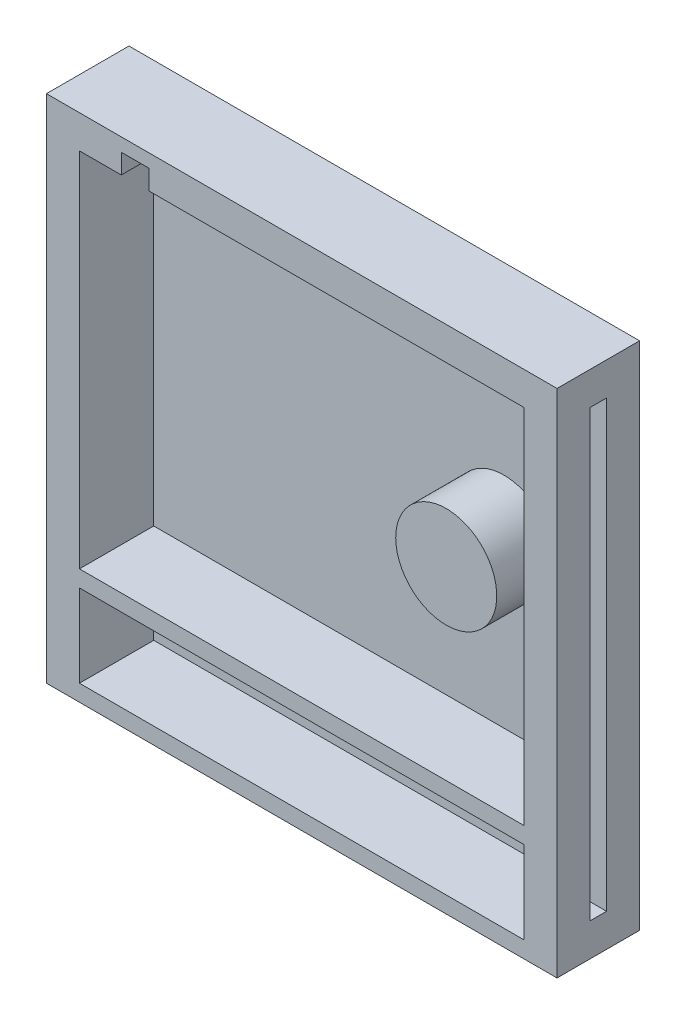
ISO-10303-21;
HEADER;
FILE_DESCRIPTION(('STEP AP214'),'2;1');
FILE_NAME('part.step','',(''),(''),'','','');
FILE_SCHEMA(('AUTOMOTIVE_DESIGN { 1 0 10303 214 1 1 1 1 }'));
ENDSEC;
DATA;
#1=APPLICATION_CONTEXT('core data for automotive mechanical design processes');
#2=APPLICATION_PROTOCOL_DEFINITION('international standard','automotive_design',2000,#1);
#3=PRODUCT_CONTEXT('',#1,'mechanical');
#4=PRODUCT('Part','Part','',(#3));
#5=PRODUCT_RELATED_PRODUCT_CATEGORY('part','',(#4));
#6=PRODUCT_DEFINITION_FORMATION('','',#4);
#7=PRODUCT_DEFINITION_CONTEXT('part definition',#1,'design');
#8=PRODUCT_DEFINITION('design','',#6,#7);
#9=PRODUCT_DEFINITION_SHAPE('','',#8);
#10=(LENGTH_UNIT() NAMED_UNIT(*) SI_UNIT(.MILLI.,.METRE.));
#11=(NAMED_UNIT(*) PLANE_ANGLE_UNIT() SI_UNIT($,.RADIAN.));
#12=(NAMED_UNIT(*) SI_UNIT($,.STERADIAN.) SOLID_ANGLE_UNIT());
#13=UNCERTAINTY_MEASURE_WITH_UNIT(LENGTH_MEASURE(1.E-05),#10,'distance_accuracy_value','');
#14=(GEOMETRIC_REPRESENTATION_CONTEXT(3) GLOBAL_UNCERTAINTY_ASSIGNED_CONTEXT((#13)) GLOBAL_UNIT_ASSIGNED_CONTEXT((#10,
#11,#12)) REPRESENTATION_CONTEXT('',''));
#15=CARTESIAN_POINT('',(0.,0.,0.));
#16=DIRECTION('',(0.,0.,1.));
#17=DIRECTION('',(1.,0.,0.));
#18=AXIS2_PLACEMENT_3D('',#15,#16,#17);
#19=CARTESIAN_POINT('',(78.5678966446695,78.5678966446696,25.4));
#20=DIRECTION('',(-1.,0.,0.));
#21=DIRECTION('',(0.,-1.,0.));
#22=AXIS2_PLACEMENT_3D('',#19,#20,#21);
#23=PLANE('',#22);
#24=DIRECTION('',(0.,1.,0.));
#25=VECTOR('',#24,1.);
#26=CARTESIAN_POINT('',(78.5678966446695,78.5678966446696,0.));
#27=LINE('',#26,#25);
#28=CARTESIAN_POINT('',(78.5678966446696,-78.5678966446696,0.));
#29=VERTEX_POINT('',#28);
#30=CARTESIAN_POINT('',(78.5678966446695,78.5678966446696,0.));
#31=VERTEX_POINT('',#30);
#32=EDGE_CURVE('E365',#29,#31,#27,.T.);
#33=ORIENTED_EDGE('',*,*,#32,.T.);
#34=DIRECTION('',(0.,0.,-1.));
#35=VECTOR('',#34,1.);
#36=CARTESIAN_POINT('',(78.5678966446695,78.5678966446696,25.4));
#37=LINE('',#36,#35);
#38=CARTESIAN_POINT('',(78.5678966446695,78.5678966446696,25.4));
#39=VERTEX_POINT('',#38);
#40=EDGE_CURVE('E370',#39,#31,#37,.T.);
#41=ORIENTED_EDGE('',*,*,#40,.F.);
#42=DIRECTION('',(0.,1.,0.));
#43=VECTOR('',#42,1.);
#44=CARTESIAN_POINT('',(78.5678966446695,78.5678966446696,25.4));
#45=LINE('',#44,#43);
#46=CARTESIAN_POINT('',(78.5678966446696,-78.5678966446696,25.4));
#47=VERTEX_POINT('',#46);
#48=EDGE_CURVE('E356',#47,#39,#45,.T.);
#49=ORIENTED_EDGE('',*,*,#48,.F.);
#50=DIRECTION('',(0.,0.,-1.));
#51=VECTOR('',#50,1.);
#52=CARTESIAN_POINT('',(78.5678966446696,-78.5678966446696,25.4));
#53=LINE('',#52,#51);
#54=EDGE_CURVE('E373',#47,#29,#53,.T.);
#55=ORIENTED_EDGE('',*,*,#54,.T.);
#56=EDGE_LOOP('',(#33,#41,#49,#55));
#57=FACE_BOUND('',#56,.T.);
#58=DIRECTION('',(0.,1.,0.));
#59=VECTOR('',#58,1.);
#60=CARTESIAN_POINT('',(78.5678966446695,-68.4078966446696,15.24));
#61=LINE('',#60,#59);
#62=CARTESIAN_POINT('',(78.5678966446696,-68.4078966446696,15.24));
#63=VERTEX_POINT('',#62);
#64=CARTESIAN_POINT('',(78.5678966446696,68.4078966446695,15.24));
#65=VERTEX_POINT('',#64);
#66=EDGE_CURVE('E59',#63,#65,#61,.T.);
#67=ORIENTED_EDGE('',*,*,#66,.T.);
#68=DIRECTION('',(0.,0.,-1.));
#69=VECTOR('',#68,1.);
#70=CARTESIAN_POINT('',(78.5678966446696,68.4078966446695,15.24));
#71=LINE('',#70,#69);
#72=CARTESIAN_POINT('',(78.5678966446696,68.4078966446695,10.16));
#73=VERTEX_POINT('',#72);
#74=EDGE_CURVE('E231',#65,#73,#71,.T.);
#75=ORIENTED_EDGE('',*,*,#74,.T.);
#76=DIRECTION('',(0.,-1.,0.));
#77=VECTOR('',#76,1.);
#78=CARTESIAN_POINT('',(78.5678966446695,-68.4078966446696,10.16));
#79=LINE('',#78,#77);
#80=CARTESIAN_POINT('',(78.5678966446695,-68.4078966446696,10.16));
#81=VERTEX_POINT('',#80);
#82=EDGE_CURVE('E242',#73,#81,#79,.T.);
#83=ORIENTED_EDGE('',*,*,#82,.T.);
#84=DIRECTION('',(0.,0.,1.));
#85=VECTOR('',#84,1.);
#86=CARTESIAN_POINT('',(78.5678966446695,-68.4078966446696,15.24));
#87=LINE('',#86,#85);
#88=EDGE_CURVE('E239',#81,#63,#87,.T.);
#89=ORIENTED_EDGE('',*,*,#88,.T.);
#90=EDGE_LOOP('',(#67,#75,#83,#89));
#91=FACE_BOUND('',#90,.T.);
#92=ADVANCED_FACE('F36',(#57,#91),#23,.F.);
#93=CARTESIAN_POINT('',(-78.5678966446696,78.5678966446695,25.4));
#94=DIRECTION('',(1.,0.,0.));
#95=DIRECTION('',(0.,1.,0.));
#96=AXIS2_PLACEMENT_3D('',#93,#94,#95);
#97=PLANE('',#96);
#98=DIRECTION('',(0.,0.,-1.));
#99=VECTOR('',#98,1.);
#100=CARTESIAN_POINT('',(-78.5678966446696,68.4078966446695,15.24));
#101=LINE('',#100,#99);
#102=CARTESIAN_POINT('',(-78.5678966446696,68.4078966446695,15.24));
#103=VERTEX_POINT('',#102);
#104=CARTESIAN_POINT('',(-78.5678966446696,68.4078966446695,10.16));
#105=VERTEX_POINT('',#104);
#106=EDGE_CURVE('E270',#103,#105,#101,.T.);
#107=ORIENTED_EDGE('',*,*,#106,.F.);
#108=DIRECTION('',(0.,1.,0.));
#109=VECTOR('',#108,1.);
#110=CARTESIAN_POINT('',(-78.5678966446695,-68.4078966446696,15.24));
#111=LINE('',#110,#109);
#112=CARTESIAN_POINT('',(-78.5678966446695,-68.4078966446696,15.24));
#113=VERTEX_POINT('',#112);
#114=EDGE_CURVE('E249',#113,#103,#111,.T.);
#115=ORIENTED_EDGE('',*,*,#114,.F.);
#116=DIRECTION('',(0.,0.,1.));
#117=VECTOR('',#116,1.);
#118=CARTESIAN_POINT('',(-78.5678966446695,-68.4078966446696,15.24));
#119=LINE('',#118,#117);
#120=CARTESIAN_POINT('',(-78.5678966446695,-68.4078966446696,10.16));
#121=VERTEX_POINT('',#120);
#122=EDGE_CURVE('E259',#121,#113,#119,.T.);
#123=ORIENTED_EDGE('',*,*,#122,.F.);
#124=DIRECTION('',(0.,-1.,0.));
#125=VECTOR('',#124,1.);
#126=CARTESIAN_POINT('',(-78.5678966446695,-68.4078966446696,10.16));
#127=LINE('',#126,#125);
#128=EDGE_CURVE('E273',#105,#121,#127,.T.);
#129=ORIENTED_EDGE('',*,*,#128,.F.);
#130=EDGE_LOOP('',(#107,#115,#123,#129));
#131=FACE_BOUND('',#130,.T.);
#132=DIRECTION('',(0.,-1.,0.));
#133=VECTOR('',#132,1.);
#134=CARTESIAN_POINT('',(-78.5678966446696,78.5678966446695,0.));
#135=LINE('',#134,#133);
#136=CARTESIAN_POINT('',(-78.5678966446696,78.5678966446695,0.));
#137=VERTEX_POINT('',#136);
#138=CARTESIAN_POINT('',(-78.5678966446695,-78.5678966446696,0.));
#139=VERTEX_POINT('',#138);
#140=EDGE_CURVE('E349',#137,#139,#135,.T.);
#141=ORIENTED_EDGE('',*,*,#140,.T.);
#142=DIRECTION('',(0.,0.,-1.));
#143=VECTOR('',#142,1.);
#144=CARTESIAN_POINT('',(-78.5678966446695,-78.5678966446696,25.4));
#145=LINE('',#144,#143);
#146=CARTESIAN_POINT('',(-78.5678966446695,-78.5678966446696,25.4));
#147=VERTEX_POINT('',#146);
#148=EDGE_CURVE('E44',#147,#139,#145,.T.);
#149=ORIENTED_EDGE('',*,*,#148,.F.);
#150=DIRECTION('',(0.,-1.,0.));
#151=VECTOR('',#150,1.);
#152=CARTESIAN_POINT('',(-78.5678966446696,78.5678966446695,25.4));
#153=LINE('',#152,#151);
#154=CARTESIAN_POINT('',(-78.5678966446696,78.5678966446695,25.4));
#155=VERTEX_POINT('',#154);
#156=EDGE_CURVE('E350',#155,#147,#153,.T.);
#157=ORIENTED_EDGE('',*,*,#156,.F.);
#158=DIRECTION('',(0.,0.,-1.));
#159=VECTOR('',#158,1.);
#160=CARTESIAN_POINT('',(-78.5678966446696,78.5678966446695,25.4));
#161=LINE('',#160,#159);
#162=EDGE_CURVE('E360',#155,#137,#161,.T.);
#163=ORIENTED_EDGE('',*,*,#162,.T.);
#164=EDGE_LOOP('',(#141,#149,#157,#163));
#165=FACE_BOUND('',#164,.T.);
#166=ADVANCED_FACE('F38',(#131,#165),#97,.F.);
#167=CARTESIAN_POINT('',(78.5678966446696,-78.5678966446696,25.4));
#168=DIRECTION('',(0.,1.,0.));
#169=DIRECTION('',(-1.,0.,0.));
#170=AXIS2_PLACEMENT_3D('',#167,#168,#169);
#171=PLANE('',#170);
#172=DIRECTION('',(1.,0.,0.));
#173=VECTOR('',#172,1.);
#174=CARTESIAN_POINT('',(78.5678966446696,-78.5678966446696,0.));
#175=LINE('',#174,#173);
#176=EDGE_CURVE('E363',#139,#29,#175,.T.);
#177=ORIENTED_EDGE('',*,*,#176,.T.);
#178=ORIENTED_EDGE('',*,*,#54,.F.);
#179=DIRECTION('',(1.,0.,0.));
#180=VECTOR('',#179,1.);
#181=CARTESIAN_POINT('',(78.5678966446696,-78.5678966446696,25.4));
#182=LINE('',#181,#180);
#183=EDGE_CURVE('E353',#147,#47,#182,.T.);
#184=ORIENTED_EDGE('',*,*,#183,.F.);
#185=ORIENTED_EDGE('',*,*,#148,.T.);
#186=EDGE_LOOP('',(#177,#178,#184,#185));
#187=FACE_BOUND('',#186,.T.);
#188=ADVANCED_FACE('F378',(#187),#171,.F.);
#189=CARTESIAN_POINT('',(78.5678966446695,78.5678966446696,25.4));
#190=DIRECTION('',(0.,-1.,0.));
#191=DIRECTION('',(1.,0.,0.));
#192=AXIS2_PLACEMENT_3D('',#189,#190,#191);
#193=PLANE('',#192);
#194=DIRECTION('',(-1.,0.,0.));
#195=VECTOR('',#194,1.);
#196=CARTESIAN_POINT('',(78.5678966446695,78.5678966446696,0.));
#197=LINE('',#196,#195);
#198=EDGE_CURVE('E354',#31,#137,#197,.T.);
#199=ORIENTED_EDGE('',*,*,#198,.T.);
#200=ORIENTED_EDGE('',*,*,#162,.F.);
#201=DIRECTION('',(-1.,0.,0.));
#202=VECTOR('',#201,1.);
#203=CARTESIAN_POINT('',(78.5678966446695,78.5678966446696,25.4));
#204=LINE('',#203,#202);
#205=EDGE_CURVE('E358',#39,#155,#204,.T.);
#206=ORIENTED_EDGE('',*,*,#205,.F.);
#207=ORIENTED_EDGE('',*,*,#40,.T.);
#208=EDGE_LOOP('',(#199,#200,#206,#207));
#209=FACE_BOUND('',#208,.T.);
#210=ADVANCED_FACE('F394',(#209),#193,.F.);
#211=CARTESIAN_POINT('',(0.,0.,25.4));
#212=DIRECTION('',(0.,0.,-1.));
#213=DIRECTION('',(-1.,0.,0.));
#214=AXIS2_PLACEMENT_3D('',#211,#212,#213);
#215=PLANE('',#214);
#216=DIRECTION('',(0.,-1.,0.));
#217=VECTOR('',#216,1.);
#218=CARTESIAN_POINT('',(-68.4078966446696,-48.0878966446696,25.4));
#219=LINE('',#218,#217);
#220=CARTESIAN_POINT('',(-68.4078966446696,-48.0878966446696,25.4));
#221=VERTEX_POINT('',#220);
#222=CARTESIAN_POINT('',(-68.4078966446696,-73.4878966446696,25.4));
#223=VERTEX_POINT('',#222);
#224=EDGE_CURVE('E290',#221,#223,#219,.T.);
#225=ORIENTED_EDGE('',*,*,#224,.F.);
#226=DIRECTION('',(-1.,0.,0.));
#227=VECTOR('',#226,1.);
#228=CARTESIAN_POINT('',(68.4078966446696,-48.0878966446696,25.4));
#229=LINE('',#228,#227);
#230=CARTESIAN_POINT('',(68.4078966446696,-48.0878966446696,25.4));
#231=VERTEX_POINT('',#230);
#232=EDGE_CURVE('E293',#231,#221,#229,.T.);
#233=ORIENTED_EDGE('',*,*,#232,.F.);
#234=DIRECTION('',(0.,1.,0.));
#235=VECTOR('',#234,1.);
#236=CARTESIAN_POINT('',(68.4078966446696,-48.0878966446696,25.4));
#237=LINE('',#236,#235);
#238=CARTESIAN_POINT('',(68.4078966446696,-73.4878966446696,25.4));
#239=VERTEX_POINT('',#238);
#240=EDGE_CURVE('E280',#239,#231,#237,.T.);
#241=ORIENTED_EDGE('',*,*,#240,.F.);
#242=DIRECTION('',(1.,0.,0.));
#243=VECTOR('',#242,1.);
#244=CARTESIAN_POINT('',(68.4078966446696,-73.4878966446696,25.4));
#245=LINE('',#244,#243);
#246=EDGE_CURVE('E287',#223,#239,#245,.T.);
#247=ORIENTED_EDGE('',*,*,#246,.F.);
#248=EDGE_LOOP('',(#225,#233,#241,#247));
#249=FACE_BOUND('',#248,.T.);
#250=DIRECTION('',(-1.,0.,0.));
#251=VECTOR('',#250,1.);
#252=CARTESIAN_POINT('',(0.,68.4078966446696,25.4));
#253=LINE('',#252,#251);
#254=CARTESIAN_POINT('',(-55.5371323051972,68.4078966446696,25.4));
#255=VERTEX_POINT('',#254);
#256=CARTESIAN_POINT('',(-68.4078966446696,68.4078966446696,25.4));
#257=VERTEX_POINT('',#256);
#258=EDGE_CURVE('E321',#255,#257,#253,.T.);
#259=ORIENTED_EDGE('',*,*,#258,.F.);
#260=DIRECTION('',(0.,-1.,0.));
#261=VECTOR('',#260,1.);
#262=CARTESIAN_POINT('',(-55.5371323051972,74.4707776309536,25.4));
#263=LINE('',#262,#261);
#264=CARTESIAN_POINT('',(-55.5371323051972,74.4707776309536,25.4));
#265=VERTEX_POINT('',#264);
#266=EDGE_CURVE('E701',#265,#255,#263,.T.);
#267=ORIENTED_EDGE('',*,*,#266,.F.);
#268=DIRECTION('',(-1.,0.,0.));
#269=VECTOR('',#268,1.);
#270=CARTESIAN_POINT('',(-55.5371323051972,74.4707776309536,25.4));
#271=LINE('',#270,#269);
#272=CARTESIAN_POINT('',(-47.0507568190186,74.4707776309536,25.4));
#273=VERTEX_POINT('',#272);
#274=EDGE_CURVE('E706',#273,#265,#271,.T.);
#275=ORIENTED_EDGE('',*,*,#274,.F.);
#276=DIRECTION('',(0.,1.,0.));
#277=VECTOR('',#276,1.);
#278=CARTESIAN_POINT('',(-47.0507568190186,74.4707776309536,25.4));
#279=LINE('',#278,#277);
#280=CARTESIAN_POINT('',(-47.0507568190186,68.4078966446696,25.4));
#281=VERTEX_POINT('',#280);
#282=EDGE_CURVE('E703',#281,#273,#279,.T.);
#283=ORIENTED_EDGE('',*,*,#282,.F.);
#284=CARTESIAN_POINT('',(68.4078966446696,68.4078966446696,25.4));
#285=VERTEX_POINT('',#284);
#286=EDGE_CURVE('E219',#285,#281,#253,.T.);
#287=ORIENTED_EDGE('',*,*,#286,.F.);
#288=DIRECTION('',(0.,-1.,0.));
#289=VECTOR('',#288,1.);
#290=CARTESIAN_POINT('',(68.4078966446696,0.,25.4));
#291=LINE('',#290,#289);
#292=CARTESIAN_POINT('',(68.4078966446696,-43.0078966446696,25.4));
#293=VERTEX_POINT('',#292);
#294=EDGE_CURVE('E322',#285,#293,#291,.T.);
#295=ORIENTED_EDGE('',*,*,#294,.T.);
#296=DIRECTION('',(1.,0.,0.));
#297=VECTOR('',#296,1.);
#298=CARTESIAN_POINT('',(0.,-43.0078966446696,25.4));
#299=LINE('',#298,#297);
#300=CARTESIAN_POINT('',(-68.4078966446696,-43.0078966446696,25.4));
#301=VERTEX_POINT('',#300);
#302=EDGE_CURVE('E327',#301,#293,#299,.T.);
#303=ORIENTED_EDGE('',*,*,#302,.F.);
#304=DIRECTION('',(0.,-1.,0.));
#305=VECTOR('',#304,1.);
#306=CARTESIAN_POINT('',(-68.4078966446696,0.,25.4));
#307=LINE('',#306,#305);
#308=EDGE_CURVE('E330',#257,#301,#307,.T.);
#309=ORIENTED_EDGE('',*,*,#308,.F.);
#310=EDGE_LOOP('',(#259,#267,#275,#283,#287,#295,#303,#309));
#311=FACE_BOUND('',#310,.T.);
#312=ORIENTED_EDGE('',*,*,#156,.T.);
#313=ORIENTED_EDGE('',*,*,#183,.T.);
#314=ORIENTED_EDGE('',*,*,#48,.T.);
#315=ORIENTED_EDGE('',*,*,#205,.T.);
#316=EDGE_LOOP('',(#312,#313,#314,#315));
#317=FACE_BOUND('',#316,.T.);
#318=ADVANCED_FACE('F396',(#249,#311,#317),#215,.F.);
#319=CARTESIAN_POINT('',(0.,0.,0.));
#320=DIRECTION('',(0.,0.,-1.));
#321=DIRECTION('',(-1.,0.,0.));
#322=AXIS2_PLACEMENT_3D('',#319,#320,#321);
#323=PLANE('',#322);
#324=ORIENTED_EDGE('',*,*,#140,.F.);
#325=ORIENTED_EDGE('',*,*,#198,.F.);
#326=ORIENTED_EDGE('',*,*,#32,.F.);
#327=ORIENTED_EDGE('',*,*,#176,.F.);
#328=EDGE_LOOP('',(#324,#325,#326,#327));
#329=FACE_BOUND('',#328,.T.);
#330=ADVANCED_FACE('F386',(#329),#323,.T.);
#331=CARTESIAN_POINT('',(0.,0.,2.54));
#332=DIRECTION('',(0.,0.,-1.));
#333=DIRECTION('',(-1.,0.,0.));
#334=AXIS2_PLACEMENT_3D('',#331,#332,#333);
#335=PLANE('',#334);
#336=CARTESIAN_POINT('',(39.3912837456988,8.89894553217759,2.54));
#337=DIRECTION('',(0.,0.,-1.));
#338=DIRECTION('',(-1.,0.,0.));
#339=AXIS2_PLACEMENT_3D('',#336,#337,#338);
#340=CIRCLE('',#339,15.5472067606427);
#341=CARTESIAN_POINT('',(23.8440769850561,8.89894553217759,2.54));
#342=VERTEX_POINT('',#341);
#343=EDGE_CURVE('E12',#342,#342,#340,.F.);
#344=ORIENTED_EDGE('',*,*,#343,.F.);
#345=EDGE_LOOP('',(#344));
#346=FACE_BOUND('',#345,.T.);
#347=DIRECTION('',(0.,-1.,0.));
#348=VECTOR('',#347,1.);
#349=CARTESIAN_POINT('',(-68.4078966446696,0.,2.53999999999999));
#350=LINE('',#349,#348);
#351=CARTESIAN_POINT('',(-68.4078966446696,68.4078966446696,2.53999999999999));
#352=VERTEX_POINT('',#351);
#353=CARTESIAN_POINT('',(-68.4078966446696,-43.0078966446696,2.53999999999999));
#354=VERTEX_POINT('',#353);
#355=EDGE_CURVE('E336',#352,#354,#350,.T.);
#356=ORIENTED_EDGE('',*,*,#355,.T.);
#357=DIRECTION('',(1.,0.,0.));
#358=VECTOR('',#357,1.);
#359=CARTESIAN_POINT('',(0.,-43.0078966446696,2.53999999999999));
#360=LINE('',#359,#358);
#361=CARTESIAN_POINT('',(68.4078966446696,-43.0078966446696,2.53999999999999));
#362=VERTEX_POINT('',#361);
#363=EDGE_CURVE('E320',#354,#362,#360,.T.);
#364=ORIENTED_EDGE('',*,*,#363,.T.);
#365=DIRECTION('',(0.,-1.,0.));
#366=VECTOR('',#365,1.);
#367=CARTESIAN_POINT('',(68.4078966446696,0.,2.53999999999999));
#368=LINE('',#367,#366);
#369=CARTESIAN_POINT('',(68.4078966446696,68.4078966446696,2.53999999999999));
#370=VERTEX_POINT('',#369);
#371=EDGE_CURVE('E318',#370,#362,#368,.T.);
#372=ORIENTED_EDGE('',*,*,#371,.F.);
#373=DIRECTION('',(-1.,0.,0.));
#374=VECTOR('',#373,1.);
#375=CARTESIAN_POINT('',(0.,68.4078966446696,2.53999999999999));
#376=LINE('',#375,#374);
#377=EDGE_CURVE('E325',#370,#352,#376,.T.);
#378=ORIENTED_EDGE('',*,*,#377,.T.);
#379=EDGE_LOOP('',(#356,#364,#372,#378));
#380=FACE_BOUND('',#379,.T.);
#381=ADVANCED_FACE('F404',(#346,#380),#335,.F.);
#382=CARTESIAN_POINT('',(0.,-43.0078966446696,-176.442739402005));
#383=DIRECTION('',(0.,-1.,0.));
#384=DIRECTION('',(0.,0.,-1.));
#385=AXIS2_PLACEMENT_3D('',#382,#383,#384);
#386=PLANE('',#385);
#387=DIRECTION('',(0.,0.,1.));
#388=VECTOR('',#387,1.);
#389=CARTESIAN_POINT('',(-68.4078966446696,-43.0078966446696,-176.442739402005));
#390=LINE('',#389,#388);
#391=EDGE_CURVE('E339',#354,#301,#390,.T.);
#392=ORIENTED_EDGE('',*,*,#391,.T.);
#393=ORIENTED_EDGE('',*,*,#302,.T.);
#394=DIRECTION('',(0.,0.,1.));
#395=VECTOR('',#394,1.);
#396=CARTESIAN_POINT('',(68.4078966446696,-43.0078966446696,-176.442739402005));
#397=LINE('',#396,#395);
#398=EDGE_CURVE('E335',#362,#293,#397,.T.);
#399=ORIENTED_EDGE('',*,*,#398,.F.);
#400=ORIENTED_EDGE('',*,*,#363,.F.);
#401=EDGE_LOOP('',(#392,#393,#399,#400));
#402=FACE_BOUND('',#401,.T.);
#403=ADVANCED_FACE('F439',(#402),#386,.F.);
#404=CARTESIAN_POINT('',(68.4078966446696,0.,-176.442739402005));
#405=DIRECTION('',(-1.,0.,0.));
#406=DIRECTION('',(0.,0.,1.));
#407=AXIS2_PLACEMENT_3D('',#404,#405,#406);
#408=PLANE('',#407);
#409=ORIENTED_EDGE('',*,*,#371,.T.);
#410=ORIENTED_EDGE('',*,*,#398,.T.);
#411=ORIENTED_EDGE('',*,*,#294,.F.);
#412=DIRECTION('',(0.,0.,1.));
#413=VECTOR('',#412,1.);
#414=CARTESIAN_POINT('',(68.4078966446696,68.4078966446696,-176.442739402005));
#415=LINE('',#414,#413);
#416=EDGE_CURVE('E326',#370,#285,#415,.T.);
#417=ORIENTED_EDGE('',*,*,#416,.F.);
#418=EDGE_LOOP('',(#409,#410,#411,#417));
#419=FACE_BOUND('',#418,.T.);
#420=ADVANCED_FACE('F444',(#419),#408,.T.);
#421=CARTESIAN_POINT('',(0.,68.4078966446696,-176.442739402005));
#422=DIRECTION('',(0.,1.,0.));
#423=DIRECTION('',(0.,0.,1.));
#424=AXIS2_PLACEMENT_3D('',#421,#422,#423);
#425=PLANE('',#424);
#426=DIRECTION('',(1.,0.,0.));
#427=VECTOR('',#426,1.);
#428=CARTESIAN_POINT('',(-55.5371323051972,68.4078966446696,10.16));
#429=LINE('',#428,#427);
#430=CARTESIAN_POINT('',(-55.5371323051972,68.4078966446696,10.16));
#431=VERTEX_POINT('',#430);
#432=CARTESIAN_POINT('',(-47.0507568190186,68.4078966446696,10.16));
#433=VERTEX_POINT('',#432);
#434=EDGE_CURVE('E209',#431,#433,#429,.T.);
#435=ORIENTED_EDGE('',*,*,#434,.F.);
#436=DIRECTION('',(0.,0.,1.));
#437=VECTOR('',#436,1.);
#438=CARTESIAN_POINT('',(-55.5371323051972,68.4078966446696,10.16));
#439=LINE('',#438,#437);
#440=EDGE_CURVE('E220',#431,#255,#439,.T.);
#441=ORIENTED_EDGE('',*,*,#440,.T.);
#442=ORIENTED_EDGE('',*,*,#258,.T.);
#443=DIRECTION('',(0.,0.,1.));
#444=VECTOR('',#443,1.);
#445=CARTESIAN_POINT('',(-68.4078966446696,68.4078966446696,-176.442739402005));
#446=LINE('',#445,#444);
#447=EDGE_CURVE('E340',#352,#257,#446,.T.);
#448=ORIENTED_EDGE('',*,*,#447,.F.);
#449=ORIENTED_EDGE('',*,*,#377,.F.);
#450=ORIENTED_EDGE('',*,*,#416,.T.);
#451=ORIENTED_EDGE('',*,*,#286,.T.);
#452=DIRECTION('',(0.,0.,1.));
#453=VECTOR('',#452,1.);
#454=CARTESIAN_POINT('',(-47.0507568190186,68.4078966446696,10.16));
#455=LINE('',#454,#453);
#456=EDGE_CURVE('E204',#433,#281,#455,.T.);
#457=ORIENTED_EDGE('',*,*,#456,.F.);
#458=EDGE_LOOP('',(#435,#441,#442,#448,#449,#450,#451,#457));
#459=FACE_BOUND('',#458,.T.);
#460=ADVANCED_FACE('F217',(#459),#425,.F.);
#461=CARTESIAN_POINT('',(-68.4078966446696,0.,-176.442739402005));
#462=DIRECTION('',(-1.,0.,0.));
#463=DIRECTION('',(0.,0.,1.));
#464=AXIS2_PLACEMENT_3D('',#461,#462,#463);
#465=PLANE('',#464);
#466=ORIENTED_EDGE('',*,*,#447,.T.);
#467=ORIENTED_EDGE('',*,*,#308,.T.);
#468=ORIENTED_EDGE('',*,*,#391,.F.);
#469=ORIENTED_EDGE('',*,*,#355,.F.);
#470=EDGE_LOOP('',(#466,#467,#468,#469));
#471=FACE_BOUND('',#470,.T.);
#472=ADVANCED_FACE('F461',(#471),#465,.F.);
#473=CARTESIAN_POINT('',(0.,0.,2.54));
#474=DIRECTION('',(0.,0.,-1.));
#475=DIRECTION('',(-1.,0.,0.));
#476=AXIS2_PLACEMENT_3D('',#473,#474,#475);
#477=PLANE('',#476);
#478=DIRECTION('',(0.,1.,0.));
#479=VECTOR('',#478,1.);
#480=CARTESIAN_POINT('',(68.4078966446696,-48.0878966446696,2.53999999999999));
#481=LINE('',#480,#479);
#482=CARTESIAN_POINT('',(68.4078966446696,-73.4878966446696,2.53999999999999));
#483=VERTEX_POINT('',#482);
#484=CARTESIAN_POINT('',(68.4078966446696,-48.0878966446696,2.53999999999999));
#485=VERTEX_POINT('',#484);
#486=EDGE_CURVE('E301',#483,#485,#481,.T.);
#487=ORIENTED_EDGE('',*,*,#486,.T.);
#488=DIRECTION('',(-1.,0.,0.));
#489=VECTOR('',#488,1.);
#490=CARTESIAN_POINT('',(68.4078966446696,-48.0878966446696,2.53999999999999));
#491=LINE('',#490,#489);
#492=CARTESIAN_POINT('',(-68.4078966446696,-48.0878966446696,2.53999999999999));
#493=VERTEX_POINT('',#492);
#494=EDGE_CURVE('E289',#485,#493,#491,.T.);
#495=ORIENTED_EDGE('',*,*,#494,.T.);
#496=DIRECTION('',(0.,-1.,0.));
#497=VECTOR('',#496,1.);
#498=CARTESIAN_POINT('',(-68.4078966446696,-48.0878966446696,2.53999999999999));
#499=LINE('',#498,#497);
#500=CARTESIAN_POINT('',(-68.4078966446696,-73.4878966446696,2.53999999999999));
#501=VERTEX_POINT('',#500);
#502=EDGE_CURVE('E310',#493,#501,#499,.T.);
#503=ORIENTED_EDGE('',*,*,#502,.T.);
#504=DIRECTION('',(1.,0.,0.));
#505=VECTOR('',#504,1.);
#506=CARTESIAN_POINT('',(68.4078966446696,-73.4878966446696,2.53999999999999));
#507=LINE('',#506,#505);
#508=EDGE_CURVE('E306',#501,#483,#507,.T.);
#509=ORIENTED_EDGE('',*,*,#508,.T.);
#510=EDGE_LOOP('',(#487,#495,#503,#509));
#511=FACE_BOUND('',#510,.T.);
#512=ADVANCED_FACE('F466',(#511),#477,.F.);
#513=CARTESIAN_POINT('',(68.4078966446696,-48.0878966446696,-139.153588862778));
#514=DIRECTION('',(0.,1.,0.));
#515=DIRECTION('',(0.,0.,1.));
#516=AXIS2_PLACEMENT_3D('',#513,#514,#515);
#517=PLANE('',#516);
#518=DIRECTION('',(0.,0.,1.));
#519=VECTOR('',#518,1.);
#520=CARTESIAN_POINT('',(68.4078966446696,-48.0878966446696,-139.153588862778));
#521=LINE('',#520,#519);
#522=EDGE_CURVE('E304',#485,#231,#521,.T.);
#523=ORIENTED_EDGE('',*,*,#522,.T.);
#524=ORIENTED_EDGE('',*,*,#232,.T.);
#525=DIRECTION('',(0.,0.,1.));
#526=VECTOR('',#525,1.);
#527=CARTESIAN_POINT('',(-68.4078966446696,-48.0878966446696,-139.153588862778));
#528=LINE('',#527,#526);
#529=EDGE_CURVE('E300',#493,#221,#528,.T.);
#530=ORIENTED_EDGE('',*,*,#529,.F.);
#531=ORIENTED_EDGE('',*,*,#494,.F.);
#532=EDGE_LOOP('',(#523,#524,#530,#531));
#533=FACE_BOUND('',#532,.T.);
#534=ADVANCED_FACE('F476',(#533),#517,.F.);
#535=CARTESIAN_POINT('',(-68.4078966446696,-48.0878966446696,-139.153588862778));
#536=DIRECTION('',(-1.,0.,0.));
#537=DIRECTION('',(0.,0.,1.));
#538=AXIS2_PLACEMENT_3D('',#535,#536,#537);
#539=PLANE('',#538);
#540=ORIENTED_EDGE('',*,*,#529,.T.);
#541=ORIENTED_EDGE('',*,*,#224,.T.);
#542=DIRECTION('',(0.,0.,1.));
#543=VECTOR('',#542,1.);
#544=CARTESIAN_POINT('',(-68.4078966446696,-73.4878966446696,-139.153588862778));
#545=LINE('',#544,#543);
#546=EDGE_CURVE('E309',#501,#223,#545,.T.);
#547=ORIENTED_EDGE('',*,*,#546,.F.);
#548=ORIENTED_EDGE('',*,*,#502,.F.);
#549=EDGE_LOOP('',(#540,#541,#547,#548));
#550=FACE_BOUND('',#549,.T.);
#551=ADVANCED_FACE('F486',(#550),#539,.F.);
#552=CARTESIAN_POINT('',(68.4078966446696,-73.4878966446696,-139.153588862778));
#553=DIRECTION('',(0.,-1.,0.));
#554=DIRECTION('',(1.,0.,0.));
#555=AXIS2_PLACEMENT_3D('',#552,#553,#554);
#556=PLANE('',#555);
#557=ORIENTED_EDGE('',*,*,#546,.T.);
#558=ORIENTED_EDGE('',*,*,#246,.T.);
#559=DIRECTION('',(0.,0.,1.));
#560=VECTOR('',#559,1.);
#561=CARTESIAN_POINT('',(68.4078966446696,-73.4878966446696,-139.153588862778));
#562=LINE('',#561,#560);
#563=EDGE_CURVE('E305',#483,#239,#562,.T.);
#564=ORIENTED_EDGE('',*,*,#563,.F.);
#565=ORIENTED_EDGE('',*,*,#508,.F.);
#566=EDGE_LOOP('',(#557,#558,#564,#565));
#567=FACE_BOUND('',#566,.T.);
#568=ADVANCED_FACE('F496',(#567),#556,.F.);
#569=CARTESIAN_POINT('',(68.4078966446696,-48.0878966446696,-139.153588862778));
#570=DIRECTION('',(1.,0.,0.));
#571=DIRECTION('',(0.,0.,-1.));
#572=AXIS2_PLACEMENT_3D('',#569,#570,#571);
#573=PLANE('',#572);
#574=ORIENTED_EDGE('',*,*,#563,.T.);
#575=ORIENTED_EDGE('',*,*,#240,.T.);
#576=ORIENTED_EDGE('',*,*,#522,.F.);
#577=ORIENTED_EDGE('',*,*,#486,.F.);
#578=EDGE_LOOP('',(#574,#575,#576,#577));
#579=FACE_BOUND('',#578,.T.);
#580=ADVANCED_FACE('F506',(#579),#573,.F.);
#581=CARTESIAN_POINT('',(-70.9478966446696,-68.4078966446696,15.24));
#582=DIRECTION('',(0.,0.,1.));
#583=DIRECTION('',(1.,0.,0.));
#584=AXIS2_PLACEMENT_3D('',#581,#582,#583);
#585=PLANE('',#584);
#586=ORIENTED_EDGE('',*,*,#114,.T.);
#587=DIRECTION('',(-1.,0.,0.));
#588=VECTOR('',#587,1.);
#589=CARTESIAN_POINT('',(-70.9478966446696,68.4078966446695,15.24));
#590=LINE('',#589,#588);
#591=CARTESIAN_POINT('',(-70.9478966446696,68.4078966446695,15.24));
#592=VERTEX_POINT('',#591);
#593=EDGE_CURVE('E268',#592,#103,#590,.T.);
#594=ORIENTED_EDGE('',*,*,#593,.F.);
#595=DIRECTION('',(0.,1.,0.));
#596=VECTOR('',#595,1.);
#597=CARTESIAN_POINT('',(-70.9478966446696,-68.4078966446696,15.24));
#598=LINE('',#597,#596);
#599=CARTESIAN_POINT('',(-70.9478966446696,-68.4078966446696,15.24));
#600=VERTEX_POINT('',#599);
#601=EDGE_CURVE('E255',#600,#592,#598,.T.);
#602=ORIENTED_EDGE('',*,*,#601,.F.);
#603=DIRECTION('',(-1.,0.,0.));
#604=VECTOR('',#603,1.);
#605=CARTESIAN_POINT('',(-70.9478966446696,-68.4078966446696,15.24));
#606=LINE('',#605,#604);
#607=EDGE_CURVE('E278',#600,#113,#606,.T.);
#608=ORIENTED_EDGE('',*,*,#607,.T.);
#609=EDGE_LOOP('',(#586,#594,#602,#608));
#610=FACE_BOUND('',#609,.T.);
#611=ADVANCED_FACE('F515',(#610),#585,.F.);
#612=CARTESIAN_POINT('',(-70.9478966446696,-68.4078966446696,15.24));
#613=DIRECTION('',(0.,-1.,0.));
#614=DIRECTION('',(1.,0.,0.));
#615=AXIS2_PLACEMENT_3D('',#612,#613,#614);
#616=PLANE('',#615);
#617=ORIENTED_EDGE('',*,*,#122,.T.);
#618=ORIENTED_EDGE('',*,*,#607,.F.);
#619=DIRECTION('',(0.,0.,1.));
#620=VECTOR('',#619,1.);
#621=CARTESIAN_POINT('',(-70.9478966446696,-68.4078966446696,15.24));
#622=LINE('',#621,#620);
#623=CARTESIAN_POINT('',(-70.9478966446696,-68.4078966446696,10.16));
#624=VERTEX_POINT('',#623);
#625=EDGE_CURVE('E265',#624,#600,#622,.T.);
#626=ORIENTED_EDGE('',*,*,#625,.F.);
#627=DIRECTION('',(-1.,0.,0.));
#628=VECTOR('',#627,1.);
#629=CARTESIAN_POINT('',(-70.9478966446696,-68.4078966446696,10.16));
#630=LINE('',#629,#628);
#631=EDGE_CURVE('E281',#624,#121,#630,.T.);
#632=ORIENTED_EDGE('',*,*,#631,.T.);
#633=EDGE_LOOP('',(#617,#618,#626,#632));
#634=FACE_BOUND('',#633,.T.);
#635=ADVANCED_FACE('F530',(#634),#616,.F.);
#636=CARTESIAN_POINT('',(-70.9478966446696,-68.4078966446696,10.16));
#637=DIRECTION('',(0.,0.,-1.));
#638=DIRECTION('',(-1.,0.,0.));
#639=AXIS2_PLACEMENT_3D('',#636,#637,#638);
#640=PLANE('',#639);
#641=ORIENTED_EDGE('',*,*,#128,.T.);
#642=ORIENTED_EDGE('',*,*,#631,.F.);
#643=DIRECTION('',(0.,-1.,0.));
#644=VECTOR('',#643,1.);
#645=CARTESIAN_POINT('',(-70.9478966446696,-68.4078966446696,10.16));
#646=LINE('',#645,#644);
#647=CARTESIAN_POINT('',(-70.9478966446696,68.4078966446695,10.16));
#648=VERTEX_POINT('',#647);
#649=EDGE_CURVE('E262',#648,#624,#646,.T.);
#650=ORIENTED_EDGE('',*,*,#649,.F.);
#651=DIRECTION('',(-1.,0.,0.));
#652=VECTOR('',#651,1.);
#653=CARTESIAN_POINT('',(-70.9478966446696,68.4078966446695,10.16));
#654=LINE('',#653,#652);
#655=EDGE_CURVE('E283',#648,#105,#654,.T.);
#656=ORIENTED_EDGE('',*,*,#655,.T.);
#657=EDGE_LOOP('',(#641,#642,#650,#656));
#658=FACE_BOUND('',#657,.T.);
#659=ADVANCED_FACE('F540',(#658),#640,.F.);
#660=CARTESIAN_POINT('',(-70.9478966446696,68.4078966446695,15.24));
#661=DIRECTION('',(0.,1.,0.));
#662=DIRECTION('',(-1.,0.,0.));
#663=AXIS2_PLACEMENT_3D('',#660,#661,#662);
#664=PLANE('',#663);
#665=ORIENTED_EDGE('',*,*,#106,.T.);
#666=ORIENTED_EDGE('',*,*,#655,.F.);
#667=DIRECTION('',(0.,0.,-1.));
#668=VECTOR('',#667,1.);
#669=CARTESIAN_POINT('',(-70.9478966446696,68.4078966446695,15.24));
#670=LINE('',#669,#668);
#671=EDGE_CURVE('E258',#592,#648,#670,.T.);
#672=ORIENTED_EDGE('',*,*,#671,.F.);
#673=ORIENTED_EDGE('',*,*,#593,.T.);
#674=EDGE_LOOP('',(#665,#666,#672,#673));
#675=FACE_BOUND('',#674,.T.);
#676=ADVANCED_FACE('F550',(#675),#664,.F.);
#677=CARTESIAN_POINT('',(-70.9478966446696,0.,0.));
#678=DIRECTION('',(-1.,0.,0.));
#679=DIRECTION('',(0.,-1.,0.));
#680=AXIS2_PLACEMENT_3D('',#677,#678,#679);
#681=PLANE('',#680);
#682=ORIENTED_EDGE('',*,*,#601,.T.);
#683=ORIENTED_EDGE('',*,*,#671,.T.);
#684=ORIENTED_EDGE('',*,*,#649,.T.);
#685=ORIENTED_EDGE('',*,*,#625,.T.);
#686=EDGE_LOOP('',(#682,#683,#684,#685));
#687=FACE_BOUND('',#686,.T.);
#688=ADVANCED_FACE('F560',(#687),#681,.T.);
#689=CARTESIAN_POINT('',(70.9478966446696,-68.4078966446696,15.24));
#690=DIRECTION('',(0.,0.,-1.));
#691=DIRECTION('',(-1.,0.,0.));
#692=AXIS2_PLACEMENT_3D('',#689,#690,#691);
#693=PLANE('',#692);
#694=ORIENTED_EDGE('',*,*,#66,.F.);
#695=DIRECTION('',(1.,0.,0.));
#696=VECTOR('',#695,1.);
#697=CARTESIAN_POINT('',(70.9478966446696,-68.4078966446696,15.24));
#698=LINE('',#697,#696);
#699=CARTESIAN_POINT('',(70.9478966446696,-68.4078966446696,15.24));
#700=VERTEX_POINT('',#699);
#701=EDGE_CURVE('E237',#700,#63,#698,.T.);
#702=ORIENTED_EDGE('',*,*,#701,.F.);
#703=DIRECTION('',(0.,1.,0.));
#704=VECTOR('',#703,1.);
#705=CARTESIAN_POINT('',(70.9478966446696,-68.4078966446696,15.24));
#706=LINE('',#705,#704);
#707=CARTESIAN_POINT('',(70.9478966446696,68.4078966446695,15.24));
#708=VERTEX_POINT('',#707);
#709=EDGE_CURVE('E227',#700,#708,#706,.T.);
#710=ORIENTED_EDGE('',*,*,#709,.T.);
#711=DIRECTION('',(1.,0.,0.));
#712=VECTOR('',#711,1.);
#713=CARTESIAN_POINT('',(70.9478966446696,68.4078966446695,15.24));
#714=LINE('',#713,#712);
#715=EDGE_CURVE('E247',#708,#65,#714,.T.);
#716=ORIENTED_EDGE('',*,*,#715,.T.);
#717=EDGE_LOOP('',(#694,#702,#710,#716));
#718=FACE_BOUND('',#717,.T.);
#719=ADVANCED_FACE('F569',(#718),#693,.T.);
#720=CARTESIAN_POINT('',(70.9478966446696,68.4078966446695,15.24));
#721=DIRECTION('',(0.,-1.,0.));
#722=DIRECTION('',(1.,0.,0.));
#723=AXIS2_PLACEMENT_3D('',#720,#721,#722);
#724=PLANE('',#723);
#725=ORIENTED_EDGE('',*,*,#74,.F.);
#726=ORIENTED_EDGE('',*,*,#715,.F.);
#727=DIRECTION('',(0.,0.,-1.));
#728=VECTOR('',#727,1.);
#729=CARTESIAN_POINT('',(70.9478966446696,68.4078966446695,15.24));
#730=LINE('',#729,#728);
#731=CARTESIAN_POINT('',(70.9478966446696,68.4078966446695,10.16));
#732=VERTEX_POINT('',#731);
#733=EDGE_CURVE('E235',#708,#732,#730,.T.);
#734=ORIENTED_EDGE('',*,*,#733,.T.);
#735=DIRECTION('',(1.,0.,0.));
#736=VECTOR('',#735,1.);
#737=CARTESIAN_POINT('',(70.9478966446696,68.4078966446695,10.16));
#738=LINE('',#737,#736);
#739=EDGE_CURVE('E250',#732,#73,#738,.T.);
#740=ORIENTED_EDGE('',*,*,#739,.T.);
#741=EDGE_LOOP('',(#725,#726,#734,#740));
#742=FACE_BOUND('',#741,.T.);
#743=ADVANCED_FACE('F584',(#742),#724,.T.);
#744=CARTESIAN_POINT('',(70.9478966446696,-68.4078966446696,10.16));
#745=DIRECTION('',(0.,0.,1.));
#746=DIRECTION('',(1.,0.,0.));
#747=AXIS2_PLACEMENT_3D('',#744,#745,#746);
#748=PLANE('',#747);
#749=ORIENTED_EDGE('',*,*,#82,.F.);
#750=ORIENTED_EDGE('',*,*,#739,.F.);
#751=DIRECTION('',(0.,-1.,0.));
#752=VECTOR('',#751,1.);
#753=CARTESIAN_POINT('',(70.9478966446696,-68.4078966446696,10.16));
#754=LINE('',#753,#752);
#755=CARTESIAN_POINT('',(70.9478966446696,-68.4078966446696,10.16));
#756=VERTEX_POINT('',#755);
#757=EDGE_CURVE('E233',#732,#756,#754,.T.);
#758=ORIENTED_EDGE('',*,*,#757,.T.);
#759=DIRECTION('',(1.,0.,0.));
#760=VECTOR('',#759,1.);
#761=CARTESIAN_POINT('',(70.9478966446696,-68.4078966446696,10.16));
#762=LINE('',#761,#760);
#763=EDGE_CURVE('E252',#756,#81,#762,.T.);
#764=ORIENTED_EDGE('',*,*,#763,.T.);
#765=EDGE_LOOP('',(#749,#750,#758,#764));
#766=FACE_BOUND('',#765,.T.);
#767=ADVANCED_FACE('F593',(#766),#748,.T.);
#768=CARTESIAN_POINT('',(70.9478966446696,-68.4078966446696,15.24));
#769=DIRECTION('',(0.,1.,0.));
#770=DIRECTION('',(-1.,0.,0.));
#771=AXIS2_PLACEMENT_3D('',#768,#769,#770);
#772=PLANE('',#771);
#773=ORIENTED_EDGE('',*,*,#88,.F.);
#774=ORIENTED_EDGE('',*,*,#763,.F.);
#775=DIRECTION('',(0.,0.,1.));
#776=VECTOR('',#775,1.);
#777=CARTESIAN_POINT('',(70.9478966446696,-68.4078966446696,15.24));
#778=LINE('',#777,#776);
#779=EDGE_CURVE('E230',#756,#700,#778,.T.);
#780=ORIENTED_EDGE('',*,*,#779,.T.);
#781=ORIENTED_EDGE('',*,*,#701,.T.);
#782=EDGE_LOOP('',(#773,#774,#780,#781));
#783=FACE_BOUND('',#782,.T.);
#784=ADVANCED_FACE('F603',(#783),#772,.T.);
#785=CARTESIAN_POINT('',(70.9478966446696,0.,0.));
#786=DIRECTION('',(1.,0.,0.));
#787=DIRECTION('',(0.,-1.,0.));
#788=AXIS2_PLACEMENT_3D('',#785,#786,#787);
#789=PLANE('',#788);
#790=ORIENTED_EDGE('',*,*,#709,.F.);
#791=ORIENTED_EDGE('',*,*,#779,.F.);
#792=ORIENTED_EDGE('',*,*,#757,.F.);
#793=ORIENTED_EDGE('',*,*,#733,.F.);
#794=EDGE_LOOP('',(#790,#791,#792,#793));
#795=FACE_BOUND('',#794,.T.);
#796=ADVANCED_FACE('F613',(#795),#789,.T.);
#797=CARTESIAN_POINT('',(-55.5371323051972,74.4707776309536,10.16));
#798=DIRECTION('',(-1.,0.,0.));
#799=DIRECTION('',(0.,0.,1.));
#800=AXIS2_PLACEMENT_3D('',#797,#798,#799);
#801=PLANE('',#800);
#802=ORIENTED_EDGE('',*,*,#266,.T.);
#803=ORIENTED_EDGE('',*,*,#440,.F.);
#804=DIRECTION('',(0.,-1.,0.));
#805=VECTOR('',#804,1.);
#806=CARTESIAN_POINT('',(-55.5371323051972,74.4707776309536,10.16));
#807=LINE('',#806,#805);
#808=CARTESIAN_POINT('',(-55.5371323051972,74.4707776309536,10.16));
#809=VERTEX_POINT('',#808);
#810=EDGE_CURVE('E51',#809,#431,#807,.T.);
#811=ORIENTED_EDGE('',*,*,#810,.F.);
#812=DIRECTION('',(0.,0.,1.));
#813=VECTOR('',#812,1.);
#814=CARTESIAN_POINT('',(-55.5371323051972,74.4707776309536,10.16));
#815=LINE('',#814,#813);
#816=EDGE_CURVE('E222',#809,#265,#815,.T.);
#817=ORIENTED_EDGE('',*,*,#816,.T.);
#818=EDGE_LOOP('',(#802,#803,#811,#817));
#819=FACE_BOUND('',#818,.T.);
#820=ADVANCED_FACE('F622',(#819),#801,.F.);
#821=CARTESIAN_POINT('',(-55.5371323051972,74.4707776309536,10.16));
#822=DIRECTION('',(0.,1.,0.));
#823=DIRECTION('',(0.,0.,1.));
#824=AXIS2_PLACEMENT_3D('',#821,#822,#823);
#825=PLANE('',#824);
#826=ORIENTED_EDGE('',*,*,#274,.T.);
#827=ORIENTED_EDGE('',*,*,#816,.F.);
#828=DIRECTION('',(-1.,0.,0.));
#829=VECTOR('',#828,1.);
#830=CARTESIAN_POINT('',(-55.5371323051972,74.4707776309536,10.16));
#831=LINE('',#830,#829);
#832=CARTESIAN_POINT('',(-47.0507568190186,74.4707776309536,10.16));
#833=VERTEX_POINT('',#832);
#834=EDGE_CURVE('E208',#833,#809,#831,.T.);
#835=ORIENTED_EDGE('',*,*,#834,.F.);
#836=DIRECTION('',(0.,0.,1.));
#837=VECTOR('',#836,1.);
#838=CARTESIAN_POINT('',(-47.0507568190186,74.4707776309536,10.16));
#839=LINE('',#838,#837);
#840=EDGE_CURVE('E206',#833,#273,#839,.T.);
#841=ORIENTED_EDGE('',*,*,#840,.T.);
#842=EDGE_LOOP('',(#826,#827,#835,#841));
#843=FACE_BOUND('',#842,.T.);
#844=ADVANCED_FACE('F642',(#843),#825,.F.);
#845=CARTESIAN_POINT('',(-47.0507568190186,74.4707776309536,10.16));
#846=DIRECTION('',(1.,0.,0.));
#847=DIRECTION('',(0.,0.,-1.));
#848=AXIS2_PLACEMENT_3D('',#845,#846,#847);
#849=PLANE('',#848);
#850=ORIENTED_EDGE('',*,*,#282,.T.);
#851=ORIENTED_EDGE('',*,*,#840,.F.);
#852=DIRECTION('',(0.,1.,0.));
#853=VECTOR('',#852,1.);
#854=CARTESIAN_POINT('',(-47.0507568190186,74.4707776309536,10.16));
#855=LINE('',#854,#853);
#856=EDGE_CURVE('E200',#433,#833,#855,.T.);
#857=ORIENTED_EDGE('',*,*,#856,.F.);
#858=ORIENTED_EDGE('',*,*,#456,.T.);
#859=EDGE_LOOP('',(#850,#851,#857,#858));
#860=FACE_BOUND('',#859,.T.);
#861=ADVANCED_FACE('F202',(#860),#849,.F.);
#862=CARTESIAN_POINT('',(0.,0.,10.16));
#863=DIRECTION('',(0.,0.,1.));
#864=DIRECTION('',(1.,0.,0.));
#865=AXIS2_PLACEMENT_3D('',#862,#863,#864);
#866=PLANE('',#865);
#867=ORIENTED_EDGE('',*,*,#810,.T.);
#868=ORIENTED_EDGE('',*,*,#434,.T.);
#869=ORIENTED_EDGE('',*,*,#856,.T.);
#870=ORIENTED_EDGE('',*,*,#834,.T.);
#871=EDGE_LOOP('',(#867,#868,#869,#870));
#872=FACE_BOUND('',#871,.T.);
#873=ADVANCED_FACE('F212',(#872),#866,.T.);
#874=CARTESIAN_POINT('',(39.3912837456988,8.89894553217759,20.32));
#875=DIRECTION('',(0.,0.,-1.));
#876=DIRECTION('',(-1.,0.,0.));
#877=AXIS2_PLACEMENT_3D('',#874,#875,#876);
#878=CYLINDRICAL_SURFACE('',#877,15.5472067606427);
#879=CARTESIAN_POINT('',(39.3912837456988,8.89894553217759,20.32));
#880=DIRECTION('',(0.,0.,1.));
#881=DIRECTION('',(1.,0.,0.));
#882=AXIS2_PLACEMENT_3D('',#879,#880,#881);
#883=CIRCLE('',#882,15.5472067606427);
#884=CARTESIAN_POINT('',(23.8440769850561,8.89894553217759,20.32));
#885=VERTEX_POINT('',#884);
#886=EDGE_CURVE('E700',#885,#885,#883,.T.);
#887=CARTESIAN_POINT('',(23.8440769850561,8.89894553217759,20.32));
#888=CARTESIAN_POINT('',(23.8440769850561,8.89894553217759,20.1347916666667));
#889=CARTESIAN_POINT('',(23.8440769850561,8.89894553217759,19.9495833333333));
#890=CARTESIAN_POINT('',(23.8440769850561,8.89894553217759,19.5791666666667));
#891=CARTESIAN_POINT('',(23.8440769850561,8.89894553217759,19.3939583333333));
#892=CARTESIAN_POINT('',(23.8440769850561,8.89894553217759,19.0235416666667));
#893=CARTESIAN_POINT('',(23.8440769850561,8.89894553217759,18.8383333333333));
#894=CARTESIAN_POINT('',(23.8440769850561,8.89894553217759,18.4679166666667));
#895=CARTESIAN_POINT('',(23.8440769850561,8.89894553217759,18.2827083333333));
#896=CARTESIAN_POINT('',(23.8440769850561,8.89894553217759,17.9122916666667));
#897=CARTESIAN_POINT('',(23.8440769850561,8.89894553217759,17.7270833333333));
#898=CARTESIAN_POINT('',(23.8440769850561,8.89894553217759,17.3566666666667));
#899=CARTESIAN_POINT('',(23.8440769850561,8.89894553217759,17.1714583333333));
#900=CARTESIAN_POINT('',(23.8440769850561,8.89894553217759,16.8010416666667));
#901=CARTESIAN_POINT('',(23.8440769850561,8.89894553217759,16.6158333333333));
#902=CARTESIAN_POINT('',(23.8440769850561,8.89894553217759,16.2454166666667));
#903=CARTESIAN_POINT('',(23.8440769850561,8.89894553217759,16.0602083333333));
#904=CARTESIAN_POINT('',(23.8440769850561,8.89894553217759,15.6897916666667));
#905=CARTESIAN_POINT('',(23.8440769850561,8.89894553217759,15.5045833333333));
#906=CARTESIAN_POINT('',(23.8440769850561,8.89894553217759,15.1341666666667));
#907=CARTESIAN_POINT('',(23.8440769850561,8.89894553217759,14.9489583333333));
#908=CARTESIAN_POINT('',(23.8440769850561,8.89894553217759,14.5785416666667));
#909=CARTESIAN_POINT('',(23.8440769850561,8.89894553217759,14.3933333333333));
#910=CARTESIAN_POINT('',(23.8440769850561,8.89894553217759,14.0229166666667));
#911=CARTESIAN_POINT('',(23.8440769850561,8.89894553217759,13.8377083333333));
#912=CARTESIAN_POINT('',(23.8440769850561,8.89894553217759,13.4672916666667));
#913=CARTESIAN_POINT('',(23.8440769850561,8.89894553217759,13.2820833333333));
#914=CARTESIAN_POINT('',(23.8440769850561,8.89894553217759,12.9116666666667));
#915=CARTESIAN_POINT('',(23.8440769850561,8.89894553217759,12.7264583333333));
#916=CARTESIAN_POINT('',(23.8440769850561,8.89894553217759,12.3560416666667));
#917=CARTESIAN_POINT('',(23.8440769850561,8.89894553217759,12.1708333333333));
#918=CARTESIAN_POINT('',(23.8440769850561,8.89894553217759,11.8004166666667));
#919=CARTESIAN_POINT('',(23.8440769850561,8.89894553217759,11.6152083333333));
#920=CARTESIAN_POINT('',(23.8440769850561,8.89894553217759,11.2447916666667));
#921=CARTESIAN_POINT('',(23.8440769850561,8.89894553217759,11.0595833333333));
#922=CARTESIAN_POINT('',(23.8440769850561,8.89894553217759,10.6891666666667));
#923=CARTESIAN_POINT('',(23.8440769850561,8.89894553217759,10.5039583333333));
#924=CARTESIAN_POINT('',(23.8440769850561,8.89894553217759,10.1335416666667));
#925=CARTESIAN_POINT('',(23.8440769850561,8.89894553217759,9.94833333333333));
#926=CARTESIAN_POINT('',(23.8440769850561,8.89894553217759,9.57791666666667));
#927=CARTESIAN_POINT('',(23.8440769850561,8.89894553217759,9.39270833333333));
#928=CARTESIAN_POINT('',(23.8440769850561,8.89894553217759,9.02229166666666));
#929=CARTESIAN_POINT('',(23.8440769850561,8.89894553217759,8.83708333333333));
#930=CARTESIAN_POINT('',(23.8440769850561,8.89894553217759,8.46666666666667));
#931=CARTESIAN_POINT('',(23.8440769850561,8.89894553217759,8.28145833333333));
#932=CARTESIAN_POINT('',(23.8440769850561,8.89894553217759,7.91104166666666));
#933=CARTESIAN_POINT('',(23.8440769850561,8.89894553217759,7.72583333333333));
#934=CARTESIAN_POINT('',(23.8440769850561,8.89894553217759,7.35541666666667));
#935=CARTESIAN_POINT('',(23.8440769850561,8.89894553217759,7.17020833333333));
#936=CARTESIAN_POINT('',(23.8440769850561,8.89894553217759,6.79979166666666));
#937=CARTESIAN_POINT('',(23.8440769850561,8.89894553217759,6.61458333333333));
#938=CARTESIAN_POINT('',(23.8440769850561,8.89894553217759,6.24416666666666));
#939=CARTESIAN_POINT('',(23.8440769850561,8.89894553217759,6.05895833333333));
#940=CARTESIAN_POINT('',(23.8440769850561,8.89894553217759,5.68854166666666));
#941=CARTESIAN_POINT('',(23.8440769850561,8.89894553217759,5.50333333333333));
#942=CARTESIAN_POINT('',(23.8440769850561,8.89894553217759,5.13291666666666));
#943=CARTESIAN_POINT('',(23.8440769850561,8.89894553217759,4.94770833333333));
#944=CARTESIAN_POINT('',(23.8440769850561,8.89894553217759,4.57729166666667));
#945=CARTESIAN_POINT('',(23.8440769850561,8.89894553217759,4.39208333333333));
#946=CARTESIAN_POINT('',(23.8440769850561,8.89894553217759,4.02166666666667));
#947=CARTESIAN_POINT('',(23.8440769850561,8.89894553217759,3.83645833333334));
#948=CARTESIAN_POINT('',(23.8440769850561,8.89894553217759,3.46604166666667));
#949=CARTESIAN_POINT('',(23.8440769850561,8.89894553217759,3.28083333333333));
#950=CARTESIAN_POINT('',(23.8440769850561,8.89894553217759,2.91041666666667));
#951=CARTESIAN_POINT('',(23.8440769850561,8.89894553217759,2.72520833333333));
#952=CARTESIAN_POINT('',(23.8440769850561,8.89894553217759,2.54));
#953=B_SPLINE_CURVE_WITH_KNOTS('',3,(#887,#888,#889,#890,#891,#892,#893,#894,#895,#896,#897,
#898,#899,#900,#901,#902,#903,#904,#905,#906,#907,#908,#909,#910,#911,#912,#913,#914,#915,#916,
#917,#918,#919,#920,#921,#922,#923,#924,#925,#926,#927,#928,#929,#930,#931,#932,#933,#934,#935,
#936,#937,#938,#939,#940,#941,#942,#943,#944,#945,#946,#947,#948,#949,#950,#951,#952),
.UNSPECIFIED.,.F.,.F.,(4,2,2,2,2,2,2,2,2,2,2,2,2,2,2,2,2,2,2,2,2,2,2,2,2,2,2,2,2,2,2,2,4),(0.,
0.555625000000001,1.11125,1.666875,2.2225,2.778125,3.33375,3.889375,4.445,5.000625,5.55625,
6.111875,6.6675,7.223125,7.77875,8.334375,8.89,9.445625,10.00125,10.556875,11.1125,11.668125,
12.22375,12.779375,13.335,13.890625,14.44625,15.001875,15.5575,16.113125,16.66875,17.224375,
17.78),.UNSPECIFIED.);
#954=EDGE_CURVE('BSEAM669',#885,#342,#953,.T.);
#955=ORIENTED_EDGE('',*,*,#886,.F.);
#956=ORIENTED_EDGE('',*,*,#343,.T.);
#957=ORIENTED_EDGE('',*,*,#954,.T.);
#958=ORIENTED_EDGE('',*,*,#954,.F.);
#959=EDGE_LOOP('',(#955,#957,#956,#958));
#960=FACE_BOUND('',#959,.T.);
#961=ADVANCED_FACE('F669',(#960),#878,.T.);
#962=CARTESIAN_POINT('',(39.3912837456988,8.89894553217759,20.32));
#963=DIRECTION('',(0.,0.,1.));
#964=DIRECTION('',(1.,0.,0.));
#965=AXIS2_PLACEMENT_3D('',#962,#963,#964);
#966=PLANE('',#965);
#967=ORIENTED_EDGE('',*,*,#886,.T.);
#968=EDGE_LOOP('',(#967));
#969=FACE_BOUND('',#968,.T.);
#970=ADVANCED_FACE('F684',(#969),#966,.T.);
#971=CLOSED_SHELL('',(#92,#166,#188,#210,#318,#330,#381,#403,#420,#460,#472,#512,#534,#551,#568,
#580,#611,#635,#659,#676,#688,#719,#743,#767,#784,#796,#820,#844,#861,#873,#961,#970));
#972=MANIFOLD_SOLID_BREP('B2',#971);
#973=ADVANCED_BREP_SHAPE_REPRESENTATION('',(#18,#972),#14);
#974=SHAPE_DEFINITION_REPRESENTATION(#9,#973);
ENDSEC;
END-ISO-10303-21;
